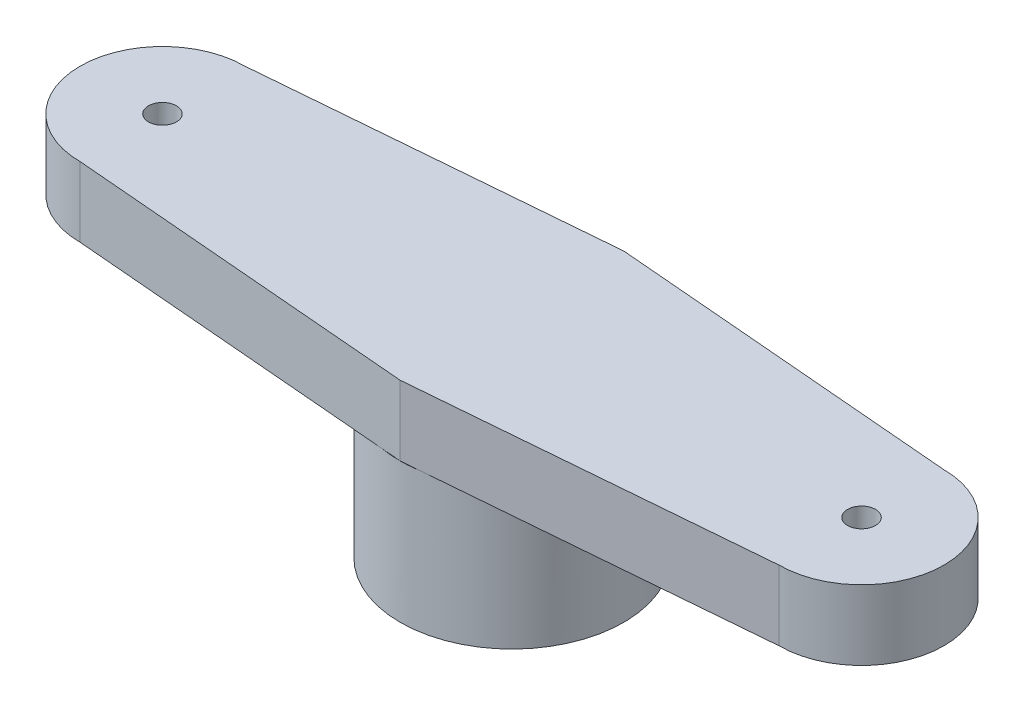
ISO-10303-21;
HEADER;
FILE_DESCRIPTION(('STEP AP214'),'2;1');
FILE_NAME('part.step','',(''),(''),'','','');
FILE_SCHEMA(('AUTOMOTIVE_DESIGN { 1 0 10303 214 1 1 1 1 }'));
ENDSEC;
DATA;
#1=APPLICATION_CONTEXT('core data for automotive mechanical design processes');
#2=APPLICATION_PROTOCOL_DEFINITION('international standard','automotive_design',2000,#1);
#3=PRODUCT_CONTEXT('',#1,'mechanical');
#4=PRODUCT('Part','Part','',(#3));
#5=PRODUCT_RELATED_PRODUCT_CATEGORY('part','',(#4));
#6=PRODUCT_DEFINITION_FORMATION('','',#4);
#7=PRODUCT_DEFINITION_CONTEXT('part definition',#1,'design');
#8=PRODUCT_DEFINITION('design','',#6,#7);
#9=PRODUCT_DEFINITION_SHAPE('','',#8);
#10=(LENGTH_UNIT() NAMED_UNIT(*) SI_UNIT(.MILLI.,.METRE.));
#11=(NAMED_UNIT(*) PLANE_ANGLE_UNIT() SI_UNIT($,.RADIAN.));
#12=(NAMED_UNIT(*) SI_UNIT($,.STERADIAN.) SOLID_ANGLE_UNIT());
#13=UNCERTAINTY_MEASURE_WITH_UNIT(LENGTH_MEASURE(1.E-05),#10,'distance_accuracy_value','');
#14=(GEOMETRIC_REPRESENTATION_CONTEXT(3) GLOBAL_UNCERTAINTY_ASSIGNED_CONTEXT((#13)) GLOBAL_UNIT_ASSIGNED_CONTEXT((#10,
#11,#12)) REPRESENTATION_CONTEXT('',''));
#15=CARTESIAN_POINT('',(0.,0.,0.));
#16=DIRECTION('',(0.,0.,1.));
#17=DIRECTION('',(1.,0.,0.));
#18=AXIS2_PLACEMENT_3D('',#15,#16,#17);
#19=CARTESIAN_POINT('',(0.,10.,0.));
#20=DIRECTION('',(0.,1.,0.));
#21=DIRECTION('',(0.,0.,1.));
#22=AXIS2_PLACEMENT_3D('',#19,#20,#21);
#23=PLANE('',#22);
#24=DIRECTION('',(0.996495444443234,0.,-0.0836470513758949));
#25=VECTOR('',#24,1.);
#26=CARTESIAN_POINT('',(25.,10.,5.90146929817049));
#27=LINE('',#26,#25);
#28=CARTESIAN_POINT('',(0.,10.,8.));
#29=VERTEX_POINT('',#28);
#30=CARTESIAN_POINT('',(1.33366249019501,10.,7.88805073273789));
#31=VERTEX_POINT('',#30);
#32=EDGE_CURVE('E216',#29,#31,#27,.T.);
#33=ORIENTED_EDGE('',*,*,#32,.F.);
#34=CARTESIAN_POINT('',(0.,10.,0.));
#35=DIRECTION('',(0.,1.,0.));
#36=DIRECTION('',(0.,0.,1.));
#37=AXIS2_PLACEMENT_3D('',#34,#35,#36);
#38=CIRCLE('',#37,8.);
#39=EDGE_CURVE('E142',#29,#31,#38,.T.);
#40=ORIENTED_EDGE('',*,*,#39,.T.);
#41=EDGE_LOOP('',(#33,#40));
#42=FACE_BOUND('',#41,.T.);
#43=ADVANCED_FACE('F41',(#42),#23,.T.);
#44=DIRECTION('',(0.996495444443234,0.,0.0836470513758949));
#45=VECTOR('',#44,1.);
#46=CARTESIAN_POINT('',(-25.,10.,5.90146929817049));
#47=LINE('',#46,#45);
#48=CARTESIAN_POINT('',(-1.33366249019501,10.,7.88805073273789));
#49=VERTEX_POINT('',#48);
#50=EDGE_CURVE('E11',#49,#29,#47,.T.);
#51=ORIENTED_EDGE('',*,*,#50,.F.);
#52=EDGE_CURVE('E145',#49,#29,#38,.T.);
#53=ORIENTED_EDGE('',*,*,#52,.T.);
#54=EDGE_LOOP('',(#51,#53));
#55=FACE_BOUND('',#54,.T.);
#56=ADVANCED_FACE('F183',(#55),#23,.T.);
#57=DIRECTION('',(-0.996495444443234,0.,-0.0836470513758954));
#58=VECTOR('',#57,1.);
#59=CARTESIAN_POINT('',(0.,10.,-8.));
#60=LINE('',#59,#58);
#61=CARTESIAN_POINT('',(1.33366249019502,10.,-7.88805073273789));
#62=VERTEX_POINT('',#61);
#63=CARTESIAN_POINT('',(0.,10.,-8.));
#64=VERTEX_POINT('',#63);
#65=EDGE_CURVE('E50',#62,#64,#60,.T.);
#66=ORIENTED_EDGE('',*,*,#65,.F.);
#67=EDGE_CURVE('E152',#62,#64,#38,.T.);
#68=ORIENTED_EDGE('',*,*,#67,.T.);
#69=EDGE_LOOP('',(#66,#68));
#70=FACE_BOUND('',#69,.T.);
#71=ADVANCED_FACE('F187',(#70),#23,.T.);
#72=DIRECTION('',(-0.996495444443234,0.,0.0836470513758954));
#73=VECTOR('',#72,1.);
#74=CARTESIAN_POINT('',(0.,10.,-8.));
#75=LINE('',#74,#73);
#76=CARTESIAN_POINT('',(-1.33366249019502,10.,-7.88805073273789));
#77=VERTEX_POINT('',#76);
#78=EDGE_CURVE('E63',#64,#77,#75,.T.);
#79=ORIENTED_EDGE('',*,*,#78,.F.);
#80=EDGE_CURVE('E155',#64,#77,#38,.T.);
#81=ORIENTED_EDGE('',*,*,#80,.T.);
#82=EDGE_LOOP('',(#79,#81));
#83=FACE_BOUND('',#82,.T.);
#84=ADVANCED_FACE('F163',(#83),#23,.T.);
#85=CARTESIAN_POINT('',(0.,0.,0.));
#86=DIRECTION('',(0.,1.,0.));
#87=DIRECTION('',(0.,0.,1.));
#88=AXIS2_PLACEMENT_3D('',#85,#86,#87);
#89=PLANE('',#88);
#90=CARTESIAN_POINT('',(0.,0.,0.));
#91=DIRECTION('',(0.,1.,0.));
#92=DIRECTION('',(0.,0.,1.));
#93=AXIS2_PLACEMENT_3D('',#90,#91,#92);
#94=CIRCLE('',#93,8.);
#95=CARTESIAN_POINT('',(0.,0.,8.));
#96=VERTEX_POINT('',#95);
#97=EDGE_CURVE('E45',#96,#96,#94,.T.);
#98=ORIENTED_EDGE('',*,*,#97,.F.);
#99=EDGE_LOOP('',(#98));
#100=FACE_BOUND('',#99,.T.);
#101=CARTESIAN_POINT('',(0.,0.,0.));
#102=DIRECTION('',(0.,1.,0.));
#103=DIRECTION('',(0.,0.,1.));
#104=AXIS2_PLACEMENT_3D('',#101,#102,#103);
#105=CIRCLE('',#104,5.25);
#106=CARTESIAN_POINT('',(0.,0.,5.25));
#107=VERTEX_POINT('',#106);
#108=EDGE_CURVE('E135',#107,#107,#105,.T.);
#109=ORIENTED_EDGE('',*,*,#108,.T.);
#110=EDGE_LOOP('',(#109));
#111=FACE_BOUND('',#110,.T.);
#112=ADVANCED_FACE('F160',(#100,#111),#89,.F.);
#113=CARTESIAN_POINT('',(0.,10.,0.));
#114=DIRECTION('',(0.,-1.,0.));
#115=DIRECTION('',(0.,0.,-1.));
#116=AXIS2_PLACEMENT_3D('',#113,#114,#115);
#117=CYLINDRICAL_SURFACE('',#116,8.);
#118=ORIENTED_EDGE('',*,*,#39,.F.);
#119=ORIENTED_EDGE('',*,*,#52,.F.);
#120=EDGE_CURVE('E153',#77,#49,#38,.T.);
#121=ORIENTED_EDGE('',*,*,#120,.F.);
#122=ORIENTED_EDGE('',*,*,#80,.F.);
#123=ORIENTED_EDGE('',*,*,#67,.F.);
#124=EDGE_CURVE('E144',#31,#62,#38,.T.);
#125=ORIENTED_EDGE('',*,*,#124,.F.);
#126=EDGE_LOOP('',(#118,#119,#121,#122,#123,#125));
#127=FACE_BOUND('',#126,.T.);
#128=ORIENTED_EDGE('',*,*,#97,.T.);
#129=EDGE_LOOP('',(#128));
#130=FACE_BOUND('',#129,.T.);
#131=ADVANCED_FACE('F43',(#127,#130),#117,.T.);
#132=CARTESIAN_POINT('',(0.,10.,0.));
#133=DIRECTION('',(0.,-1.,0.));
#134=DIRECTION('',(0.,0.,-1.));
#135=AXIS2_PLACEMENT_3D('',#132,#133,#134);
#136=CYLINDRICAL_SURFACE('',#135,5.25);
#137=CARTESIAN_POINT('',(0.,10.,0.));
#138=DIRECTION('',(0.,1.,0.));
#139=DIRECTION('',(0.,0.,1.));
#140=AXIS2_PLACEMENT_3D('',#137,#138,#139);
#141=CIRCLE('',#140,5.25);
#142=CARTESIAN_POINT('',(0.,10.,5.25));
#143=VERTEX_POINT('',#142);
#144=EDGE_CURVE('E132',#143,#143,#141,.T.);
#145=ORIENTED_EDGE('',*,*,#144,.T.);
#146=EDGE_LOOP('',(#145));
#147=FACE_BOUND('',#146,.T.);
#148=ORIENTED_EDGE('',*,*,#108,.F.);
#149=EDGE_LOOP('',(#148));
#150=FACE_BOUND('',#149,.T.);
#151=ADVANCED_FACE('F166',(#147,#150),#136,.F.);
#152=CARTESIAN_POINT('',(25.,10.,0.));
#153=DIRECTION('',(0.,-1.,0.));
#154=DIRECTION('',(0.,0.,-1.));
#155=AXIS2_PLACEMENT_3D('',#152,#153,#154);
#156=PLANE('',#155);
#157=CARTESIAN_POINT('',(-25.,10.,0.));
#158=DIRECTION('',(0.,1.,0.));
#159=DIRECTION('',(0.,0.,1.));
#160=AXIS2_PLACEMENT_3D('',#157,#158,#159);
#161=CIRCLE('',#160,1.);
#162=CARTESIAN_POINT('',(-25.,10.,1.00000000000001));
#163=VERTEX_POINT('',#162);
#164=EDGE_CURVE('E205',#163,#163,#161,.T.);
#165=ORIENTED_EDGE('',*,*,#164,.T.);
#166=EDGE_LOOP('',(#165));
#167=FACE_BOUND('',#166,.T.);
#168=CARTESIAN_POINT('',(-25.,10.,-5.90146929817047));
#169=VERTEX_POINT('',#168);
#170=EDGE_CURVE('E204',#77,#169,#75,.T.);
#171=ORIENTED_EDGE('',*,*,#170,.F.);
#172=ORIENTED_EDGE('',*,*,#120,.T.);
#173=CARTESIAN_POINT('',(-25.,10.,5.90146929817049));
#174=VERTEX_POINT('',#173);
#175=EDGE_CURVE('E52',#174,#49,#47,.T.);
#176=ORIENTED_EDGE('',*,*,#175,.F.);
#177=CARTESIAN_POINT('',(-25.,10.,0.));
#178=DIRECTION('',(0.,1.,0.));
#179=DIRECTION('',(0.,0.,1.));
#180=AXIS2_PLACEMENT_3D('',#177,#178,#179);
#181=CIRCLE('',#180,5.90146929817048);
#182=EDGE_CURVE('E213',#169,#174,#181,.T.);
#183=ORIENTED_EDGE('',*,*,#182,.F.);
#184=EDGE_LOOP('',(#171,#172,#176,#183));
#185=FACE_BOUND('',#184,.T.);
#186=ADVANCED_FACE('F168',(#167,#185),#156,.T.);
#187=CARTESIAN_POINT('',(25.,15.,0.));
#188=DIRECTION('',(0.,-1.,0.));
#189=DIRECTION('',(0.,0.,-1.));
#190=AXIS2_PLACEMENT_3D('',#187,#188,#189);
#191=PLANE('',#190);
#192=CARTESIAN_POINT('',(-25.,15.,0.));
#193=DIRECTION('',(0.,1.,0.));
#194=DIRECTION('',(0.,0.,1.));
#195=AXIS2_PLACEMENT_3D('',#192,#193,#194);
#196=CIRCLE('',#195,1.);
#197=CARTESIAN_POINT('',(-25.,15.,1.00000000000001));
#198=VERTEX_POINT('',#197);
#199=EDGE_CURVE('E208',#198,#198,#196,.T.);
#200=ORIENTED_EDGE('',*,*,#199,.F.);
#201=EDGE_LOOP('',(#200));
#202=FACE_BOUND('',#201,.T.);
#203=CARTESIAN_POINT('',(25.,15.,0.));
#204=DIRECTION('',(0.,1.,0.));
#205=DIRECTION('',(0.,0.,1.));
#206=AXIS2_PLACEMENT_3D('',#203,#204,#205);
#207=CIRCLE('',#206,1.);
#208=CARTESIAN_POINT('',(25.,15.,1.));
#209=VERTEX_POINT('',#208);
#210=EDGE_CURVE('E248',#209,#209,#207,.T.);
#211=ORIENTED_EDGE('',*,*,#210,.F.);
#212=EDGE_LOOP('',(#211));
#213=FACE_BOUND('',#212,.T.);
#214=DIRECTION('',(-0.996495444443234,0.,-0.0836470513758954));
#215=VECTOR('',#214,1.);
#216=CARTESIAN_POINT('',(0.,15.,-8.));
#217=LINE('',#216,#215);
#218=CARTESIAN_POINT('',(25.,15.,-5.90146929817048));
#219=VERTEX_POINT('',#218);
#220=CARTESIAN_POINT('',(0.,15.,-8.));
#221=VERTEX_POINT('',#220);
#222=EDGE_CURVE('E118',#219,#221,#217,.T.);
#223=ORIENTED_EDGE('',*,*,#222,.T.);
#224=DIRECTION('',(-0.996495444443234,0.,0.0836470513758954));
#225=VECTOR('',#224,1.);
#226=CARTESIAN_POINT('',(0.,15.,-8.));
#227=LINE('',#226,#225);
#228=CARTESIAN_POINT('',(-25.,15.,-5.90146929817047));
#229=VERTEX_POINT('',#228);
#230=EDGE_CURVE('E108',#221,#229,#227,.T.);
#231=ORIENTED_EDGE('',*,*,#230,.T.);
#232=CARTESIAN_POINT('',(-25.,15.,0.));
#233=DIRECTION('',(0.,1.,0.));
#234=DIRECTION('',(0.,0.,1.));
#235=AXIS2_PLACEMENT_3D('',#232,#233,#234);
#236=CIRCLE('',#235,5.90146929817048);
#237=CARTESIAN_POINT('',(-25.,15.,5.90146929817049));
#238=VERTEX_POINT('',#237);
#239=EDGE_CURVE('E117',#229,#238,#236,.T.);
#240=ORIENTED_EDGE('',*,*,#239,.T.);
#241=DIRECTION('',(0.996495444443234,0.,0.0836470513758949));
#242=VECTOR('',#241,1.);
#243=CARTESIAN_POINT('',(-25.,15.,5.90146929817049));
#244=LINE('',#243,#242);
#245=CARTESIAN_POINT('',(0.,15.,8.));
#246=VERTEX_POINT('',#245);
#247=EDGE_CURVE('E232',#238,#246,#244,.T.);
#248=ORIENTED_EDGE('',*,*,#247,.T.);
#249=DIRECTION('',(0.996495444443234,0.,-0.0836470513758949));
#250=VECTOR('',#249,1.);
#251=CARTESIAN_POINT('',(25.,15.,5.90146929817049));
#252=LINE('',#251,#250);
#253=CARTESIAN_POINT('',(25.,15.,5.90146929817049));
#254=VERTEX_POINT('',#253);
#255=EDGE_CURVE('E241',#246,#254,#252,.T.);
#256=ORIENTED_EDGE('',*,*,#255,.T.);
#257=CARTESIAN_POINT('',(25.,15.,0.));
#258=DIRECTION('',(0.,1.,0.));
#259=DIRECTION('',(0.,0.,-1.));
#260=AXIS2_PLACEMENT_3D('',#257,#258,#259);
#261=CIRCLE('',#260,5.90146929817048);
#262=EDGE_CURVE('E123',#254,#219,#261,.T.);
#263=ORIENTED_EDGE('',*,*,#262,.T.);
#264=EDGE_LOOP('',(#223,#231,#240,#248,#256,#263));
#265=FACE_BOUND('',#264,.T.);
#266=ADVANCED_FACE('F121',(#202,#213,#265),#191,.F.);
#267=CARTESIAN_POINT('',(25.,15.,0.));
#268=DIRECTION('',(0.,-1.,0.));
#269=DIRECTION('',(0.,0.,-1.));
#270=AXIS2_PLACEMENT_3D('',#267,#268,#269);
#271=CYLINDRICAL_SURFACE('',#270,5.90146929817048);
#272=CARTESIAN_POINT('',(25.,10.,0.));
#273=DIRECTION('',(0.,1.,0.));
#274=DIRECTION('',(0.,0.,-1.));
#275=AXIS2_PLACEMENT_3D('',#272,#273,#274);
#276=CIRCLE('',#275,5.90146929817048);
#277=CARTESIAN_POINT('',(25.,10.,5.90146929817049));
#278=VERTEX_POINT('',#277);
#279=CARTESIAN_POINT('',(25.,10.,-5.90146929817048));
#280=VERTEX_POINT('',#279);
#281=EDGE_CURVE('E127',#278,#280,#276,.T.);
#282=ORIENTED_EDGE('',*,*,#281,.T.);
#283=DIRECTION('',(0.,-1.,0.));
#284=VECTOR('',#283,1.);
#285=CARTESIAN_POINT('',(25.,15.,-5.90146929817048));
#286=LINE('',#285,#284);
#287=EDGE_CURVE('E203',#219,#280,#286,.T.);
#288=ORIENTED_EDGE('',*,*,#287,.F.);
#289=ORIENTED_EDGE('',*,*,#262,.F.);
#290=DIRECTION('',(0.,-1.,0.));
#291=VECTOR('',#290,1.);
#292=CARTESIAN_POINT('',(25.,15.,5.90146929817049));
#293=LINE('',#292,#291);
#294=EDGE_CURVE('E220',#254,#278,#293,.T.);
#295=ORIENTED_EDGE('',*,*,#294,.T.);
#296=EDGE_LOOP('',(#282,#288,#289,#295));
#297=FACE_BOUND('',#296,.T.);
#298=ADVANCED_FACE('F258',(#297),#271,.T.);
#299=CARTESIAN_POINT('',(25.,15.,5.90146929817049));
#300=DIRECTION('',(-0.0836470513758949,0.,-0.996495444443234));
#301=DIRECTION('',(-0.996495444443234,0.,0.0836470513758949));
#302=AXIS2_PLACEMENT_3D('',#299,#300,#301);
#303=PLANE('',#302);
#304=ORIENTED_EDGE('',*,*,#32,.T.);
#305=EDGE_CURVE('E201',#31,#278,#27,.T.);
#306=ORIENTED_EDGE('',*,*,#305,.T.);
#307=ORIENTED_EDGE('',*,*,#294,.F.);
#308=ORIENTED_EDGE('',*,*,#255,.F.);
#309=DIRECTION('',(0.,-1.,0.));
#310=VECTOR('',#309,1.);
#311=CARTESIAN_POINT('',(0.,15.,8.));
#312=LINE('',#311,#310);
#313=EDGE_CURVE('E223',#246,#29,#312,.T.);
#314=ORIENTED_EDGE('',*,*,#313,.T.);
#315=EDGE_LOOP('',(#304,#306,#307,#308,#314));
#316=FACE_BOUND('',#315,.T.);
#317=ADVANCED_FACE('F239',(#316),#303,.F.);
#318=CARTESIAN_POINT('',(-25.,15.,5.90146929817049));
#319=DIRECTION('',(0.0836470513758949,0.,-0.996495444443234));
#320=DIRECTION('',(-0.996495444443234,0.,-0.0836470513758949));
#321=AXIS2_PLACEMENT_3D('',#318,#319,#320);
#322=PLANE('',#321);
#323=ORIENTED_EDGE('',*,*,#175,.T.);
#324=ORIENTED_EDGE('',*,*,#50,.T.);
#325=ORIENTED_EDGE('',*,*,#313,.F.);
#326=ORIENTED_EDGE('',*,*,#247,.F.);
#327=DIRECTION('',(0.,-1.,0.));
#328=VECTOR('',#327,1.);
#329=CARTESIAN_POINT('',(-25.,15.,5.90146929817049));
#330=LINE('',#329,#328);
#331=EDGE_CURVE('E137',#238,#174,#330,.T.);
#332=ORIENTED_EDGE('',*,*,#331,.T.);
#333=EDGE_LOOP('',(#323,#324,#325,#326,#332));
#334=FACE_BOUND('',#333,.T.);
#335=ADVANCED_FACE('F230',(#334),#322,.F.);
#336=CARTESIAN_POINT('',(-25.,15.,0.));
#337=DIRECTION('',(0.,-1.,0.));
#338=DIRECTION('',(0.,0.,-1.));
#339=AXIS2_PLACEMENT_3D('',#336,#337,#338);
#340=CYLINDRICAL_SURFACE('',#339,5.90146929817048);
#341=ORIENTED_EDGE('',*,*,#182,.T.);
#342=ORIENTED_EDGE('',*,*,#331,.F.);
#343=ORIENTED_EDGE('',*,*,#239,.F.);
#344=DIRECTION('',(0.,-1.,0.));
#345=VECTOR('',#344,1.);
#346=CARTESIAN_POINT('',(-25.,15.,-5.90146929817047));
#347=LINE('',#346,#345);
#348=EDGE_CURVE('E114',#229,#169,#347,.T.);
#349=ORIENTED_EDGE('',*,*,#348,.T.);
#350=EDGE_LOOP('',(#341,#342,#343,#349));
#351=FACE_BOUND('',#350,.T.);
#352=ADVANCED_FACE('F283',(#351),#340,.T.);
#353=CARTESIAN_POINT('',(0.,15.,-8.));
#354=DIRECTION('',(0.0836470513758954,0.,0.996495444443234));
#355=DIRECTION('',(0.996495444443234,0.,-0.0836470513758954));
#356=AXIS2_PLACEMENT_3D('',#353,#354,#355);
#357=PLANE('',#356);
#358=ORIENTED_EDGE('',*,*,#78,.T.);
#359=ORIENTED_EDGE('',*,*,#170,.T.);
#360=ORIENTED_EDGE('',*,*,#348,.F.);
#361=ORIENTED_EDGE('',*,*,#230,.F.);
#362=DIRECTION('',(0.,-1.,0.));
#363=VECTOR('',#362,1.);
#364=CARTESIAN_POINT('',(0.,15.,-8.));
#365=LINE('',#364,#363);
#366=EDGE_CURVE('E112',#221,#64,#365,.T.);
#367=ORIENTED_EDGE('',*,*,#366,.T.);
#368=EDGE_LOOP('',(#358,#359,#360,#361,#367));
#369=FACE_BOUND('',#368,.T.);
#370=ADVANCED_FACE('F110',(#369),#357,.F.);
#371=CARTESIAN_POINT('',(0.,15.,-8.));
#372=DIRECTION('',(-0.0836470513758954,0.,0.996495444443234));
#373=DIRECTION('',(0.996495444443234,0.,0.0836470513758954));
#374=AXIS2_PLACEMENT_3D('',#371,#372,#373);
#375=PLANE('',#374);
#376=EDGE_CURVE('E150',#280,#62,#60,.T.);
#377=ORIENTED_EDGE('',*,*,#376,.T.);
#378=ORIENTED_EDGE('',*,*,#65,.T.);
#379=ORIENTED_EDGE('',*,*,#366,.F.);
#380=ORIENTED_EDGE('',*,*,#222,.F.);
#381=ORIENTED_EDGE('',*,*,#287,.T.);
#382=EDGE_LOOP('',(#377,#378,#379,#380,#381));
#383=FACE_BOUND('',#382,.T.);
#384=ADVANCED_FACE('F131',(#383),#375,.F.);
#385=CARTESIAN_POINT('',(25.,10.,0.));
#386=DIRECTION('',(0.,1.,0.));
#387=DIRECTION('',(0.,0.,1.));
#388=AXIS2_PLACEMENT_3D('',#385,#386,#387);
#389=CIRCLE('',#388,1.);
#390=CARTESIAN_POINT('',(25.,10.,1.));
#391=VERTEX_POINT('',#390);
#392=EDGE_CURVE('E245',#391,#391,#389,.T.);
#393=ORIENTED_EDGE('',*,*,#392,.T.);
#394=EDGE_LOOP('',(#393));
#395=FACE_BOUND('',#394,.T.);
#396=ORIENTED_EDGE('',*,*,#305,.F.);
#397=ORIENTED_EDGE('',*,*,#124,.T.);
#398=ORIENTED_EDGE('',*,*,#376,.F.);
#399=ORIENTED_EDGE('',*,*,#281,.F.);
#400=EDGE_LOOP('',(#396,#397,#398,#399));
#401=FACE_BOUND('',#400,.T.);
#402=ADVANCED_FACE('F177',(#395,#401),#156,.T.);
#403=ORIENTED_EDGE('',*,*,#144,.F.);
#404=EDGE_LOOP('',(#403));
#405=FACE_BOUND('',#404,.T.);
#406=ADVANCED_FACE('F178',(#405),#156,.T.);
#407=CARTESIAN_POINT('',(25.,10.,0.));
#408=DIRECTION('',(0.,1.,0.));
#409=DIRECTION('',(0.,0.,1.));
#410=AXIS2_PLACEMENT_3D('',#407,#408,#409);
#411=CYLINDRICAL_SURFACE('',#410,1.);
#412=ORIENTED_EDGE('',*,*,#392,.F.);
#413=EDGE_LOOP('',(#412));
#414=FACE_BOUND('',#413,.T.);
#415=ORIENTED_EDGE('',*,*,#210,.T.);
#416=EDGE_LOOP('',(#415));
#417=FACE_BOUND('',#416,.T.);
#418=ADVANCED_FACE('F262',(#414,#417),#411,.F.);
#419=CARTESIAN_POINT('',(-25.,10.,0.));
#420=DIRECTION('',(0.,1.,0.));
#421=DIRECTION('',(0.,0.,1.));
#422=AXIS2_PLACEMENT_3D('',#419,#420,#421);
#423=CYLINDRICAL_SURFACE('',#422,1.);
#424=ORIENTED_EDGE('',*,*,#164,.F.);
#425=EDGE_LOOP('',(#424));
#426=FACE_BOUND('',#425,.T.);
#427=ORIENTED_EDGE('',*,*,#199,.T.);
#428=EDGE_LOOP('',(#427));
#429=FACE_BOUND('',#428,.T.);
#430=ADVANCED_FACE('F254',(#426,#429),#423,.F.);
#431=CLOSED_SHELL('',(#43,#56,#71,#84,#112,#131,#151,#186,#266,#298,#317,#335,#352,#370,#384,
#402,#406,#418,#430));
#432=MANIFOLD_SOLID_BREP('B2',#431);
#433=ADVANCED_BREP_SHAPE_REPRESENTATION('',(#18,#432),#14);
#434=SHAPE_DEFINITION_REPRESENTATION(#9,#433);
ENDSEC;
END-ISO-10303-21;
